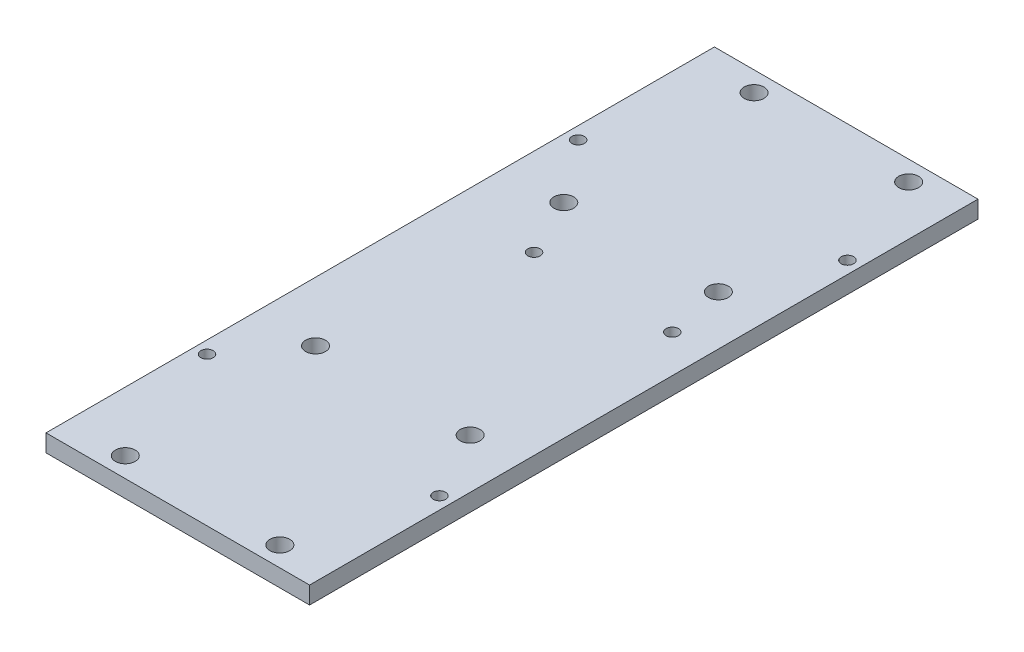
ISO-10303-21;
HEADER;
FILE_DESCRIPTION(('STEP AP214'),'2;1');
FILE_NAME('part.step','',(''),(''),'','','');
FILE_SCHEMA(('AUTOMOTIVE_DESIGN { 1 0 10303 214 1 1 1 1 }'));
ENDSEC;
DATA;
#1=APPLICATION_CONTEXT('core data for automotive mechanical design processes');
#2=APPLICATION_PROTOCOL_DEFINITION('international standard','automotive_design',2000,#1);
#3=PRODUCT_CONTEXT('',#1,'mechanical');
#4=PRODUCT('Part','Part','',(#3));
#5=PRODUCT_RELATED_PRODUCT_CATEGORY('part','',(#4));
#6=PRODUCT_DEFINITION_FORMATION('','',#4);
#7=PRODUCT_DEFINITION_CONTEXT('part definition',#1,'design');
#8=PRODUCT_DEFINITION('design','',#6,#7);
#9=PRODUCT_DEFINITION_SHAPE('','',#8);
#10=(LENGTH_UNIT() NAMED_UNIT(*) SI_UNIT(.MILLI.,.METRE.));
#11=(NAMED_UNIT(*) PLANE_ANGLE_UNIT() SI_UNIT($,.RADIAN.));
#12=(NAMED_UNIT(*) SI_UNIT($,.STERADIAN.) SOLID_ANGLE_UNIT());
#13=UNCERTAINTY_MEASURE_WITH_UNIT(LENGTH_MEASURE(1.E-05),#10,'distance_accuracy_value','');
#14=(GEOMETRIC_REPRESENTATION_CONTEXT(3) GLOBAL_UNCERTAINTY_ASSIGNED_CONTEXT((#13)) GLOBAL_UNIT_ASSIGNED_CONTEXT((#10,
#11,#12)) REPRESENTATION_CONTEXT('',''));
#15=CARTESIAN_POINT('',(0.,0.,0.));
#16=DIRECTION('',(0.,0.,1.));
#17=DIRECTION('',(1.,0.,0.));
#18=AXIS2_PLACEMENT_3D('',#15,#16,#17);
#19=CARTESIAN_POINT('',(0.,3.5,0.));
#20=DIRECTION('',(0.,1.,0.));
#21=DIRECTION('',(0.,0.,1.));
#22=AXIS2_PLACEMENT_3D('',#19,#20,#21);
#23=PLANE('',#22);
#24=CARTESIAN_POINT('',(-41.2,3.5,-92.5));
#25=DIRECTION('',(0.,1.,0.));
#26=DIRECTION('',(0.,0.,-1.));
#27=AXIS2_PLACEMENT_3D('',#24,#25,#26);
#28=CIRCLE('',#27,2.);
#29=CARTESIAN_POINT('',(-41.2,3.5,-94.5));
#30=VERTEX_POINT('',#29);
#31=EDGE_CURVE('E192',#30,#30,#28,.T.);
#32=ORIENTED_EDGE('',*,*,#31,.F.);
#33=EDGE_LOOP('',(#32));
#34=FACE_BOUND('',#33,.T.);
#35=CARTESIAN_POINT('',(-10.,3.5,-92.5));
#36=DIRECTION('',(0.,1.,0.));
#37=DIRECTION('',(0.,0.,-1.));
#38=AXIS2_PLACEMENT_3D('',#35,#36,#37);
#39=CIRCLE('',#38,2.);
#40=CARTESIAN_POINT('',(-10.,3.5,-94.5));
#41=VERTEX_POINT('',#40);
#42=EDGE_CURVE('E186',#41,#41,#39,.T.);
#43=ORIENTED_EDGE('',*,*,#42,.F.);
#44=EDGE_LOOP('',(#43));
#45=FACE_BOUND('',#44,.T.);
#46=CARTESIAN_POINT('',(-10.,3.5,-130.9));
#47=DIRECTION('',(0.,1.,0.));
#48=DIRECTION('',(0.,0.,-1.));
#49=AXIS2_PLACEMENT_3D('',#46,#47,#48);
#50=CIRCLE('',#49,2.);
#51=CARTESIAN_POINT('',(-10.,3.5,-132.9));
#52=VERTEX_POINT('',#51);
#53=EDGE_CURVE('E180',#52,#52,#50,.T.);
#54=ORIENTED_EDGE('',*,*,#53,.F.);
#55=EDGE_LOOP('',(#54));
#56=FACE_BOUND('',#55,.T.);
#57=CARTESIAN_POINT('',(-41.2,3.5,-130.9));
#58=DIRECTION('',(0.,1.,0.));
#59=DIRECTION('',(0.,0.,-1.));
#60=AXIS2_PLACEMENT_3D('',#57,#58,#59);
#61=CIRCLE('',#60,2.00000000000001);
#62=CARTESIAN_POINT('',(-41.2,3.5,-132.9));
#63=VERTEX_POINT('',#62);
#64=EDGE_CURVE('E174',#63,#63,#61,.T.);
#65=ORIENTED_EDGE('',*,*,#64,.F.);
#66=EDGE_LOOP('',(#65));
#67=FACE_BOUND('',#66,.T.);
#68=CARTESIAN_POINT('',(-9.99999999999999,3.5,-42.4));
#69=DIRECTION('',(0.,1.,0.));
#70=DIRECTION('',(0.,0.,1.));
#71=AXIS2_PLACEMENT_3D('',#68,#69,#70);
#72=CIRCLE('',#71,2.);
#73=CARTESIAN_POINT('',(-9.99999999999999,3.5,-40.4));
#74=VERTEX_POINT('',#73);
#75=EDGE_CURVE('E168',#74,#74,#72,.T.);
#76=ORIENTED_EDGE('',*,*,#75,.F.);
#77=EDGE_LOOP('',(#76));
#78=FACE_BOUND('',#77,.T.);
#79=CARTESIAN_POINT('',(-41.2,3.5,-42.4));
#80=DIRECTION('',(0.,1.,0.));
#81=DIRECTION('',(0.,0.,1.));
#82=AXIS2_PLACEMENT_3D('',#79,#80,#81);
#83=CIRCLE('',#82,2.);
#84=CARTESIAN_POINT('',(-41.2,3.5,-40.4));
#85=VERTEX_POINT('',#84);
#86=EDGE_CURVE('E162',#85,#85,#83,.T.);
#87=ORIENTED_EDGE('',*,*,#86,.F.);
#88=EDGE_LOOP('',(#87));
#89=FACE_BOUND('',#88,.T.);
#90=CARTESIAN_POINT('',(-9.99999999999999,3.5,-4.));
#91=DIRECTION('',(0.,1.,0.));
#92=DIRECTION('',(0.,0.,1.));
#93=AXIS2_PLACEMENT_3D('',#90,#91,#92);
#94=CIRCLE('',#93,2.);
#95=CARTESIAN_POINT('',(-9.99999999999999,3.5,-2.));
#96=VERTEX_POINT('',#95);
#97=EDGE_CURVE('E156',#96,#96,#94,.T.);
#98=ORIENTED_EDGE('',*,*,#97,.F.);
#99=EDGE_LOOP('',(#98));
#100=FACE_BOUND('',#99,.T.);
#101=CARTESIAN_POINT('',(-41.2,3.5,-4.));
#102=DIRECTION('',(0.,1.,0.));
#103=DIRECTION('',(0.,0.,1.));
#104=AXIS2_PLACEMENT_3D('',#101,#102,#103);
#105=CIRCLE('',#104,2.);
#106=CARTESIAN_POINT('',(-41.2,3.5,-2.));
#107=VERTEX_POINT('',#106);
#108=EDGE_CURVE('E150',#107,#107,#105,.T.);
#109=ORIENTED_EDGE('',*,*,#108,.F.);
#110=EDGE_LOOP('',(#109));
#111=FACE_BOUND('',#110,.T.);
#112=CARTESIAN_POINT('',(-50.7,3.5,-30.));
#113=DIRECTION('',(0.,1.,0.));
#114=DIRECTION('',(0.,0.,1.));
#115=AXIS2_PLACEMENT_3D('',#112,#113,#114);
#116=CIRCLE('',#115,1.25);
#117=CARTESIAN_POINT('',(-50.7,3.5,-28.75));
#118=VERTEX_POINT('',#117);
#119=EDGE_CURVE('E135',#118,#118,#116,.T.);
#120=ORIENTED_EDGE('',*,*,#119,.F.);
#121=EDGE_LOOP('',(#120));
#122=FACE_BOUND('',#121,.T.);
#123=CARTESIAN_POINT('',(-35.5,3.5,-80.8));
#124=DIRECTION('',(0.,1.,0.));
#125=DIRECTION('',(0.,0.,1.));
#126=AXIS2_PLACEMENT_3D('',#123,#124,#125);
#127=CIRCLE('',#126,1.25);
#128=CARTESIAN_POINT('',(-35.5,3.5,-79.55));
#129=VERTEX_POINT('',#128);
#130=EDGE_CURVE('E123',#129,#129,#127,.T.);
#131=ORIENTED_EDGE('',*,*,#130,.F.);
#132=EDGE_LOOP('',(#131));
#133=FACE_BOUND('',#132,.T.);
#134=CARTESIAN_POINT('',(-50.7,3.5,-104.9));
#135=DIRECTION('',(0.,1.,0.));
#136=DIRECTION('',(0.,0.,1.));
#137=AXIS2_PLACEMENT_3D('',#134,#135,#136);
#138=CIRCLE('',#137,1.25);
#139=CARTESIAN_POINT('',(-50.7,3.5,-103.65));
#140=VERTEX_POINT('',#139);
#141=EDGE_CURVE('E102',#140,#140,#138,.T.);
#142=ORIENTED_EDGE('',*,*,#141,.F.);
#143=EDGE_LOOP('',(#142));
#144=FACE_BOUND('',#143,.T.);
#145=DIRECTION('',(0.,0.,1.));
#146=VECTOR('',#145,1.);
#147=CARTESIAN_POINT('',(-53.2,3.5,-134.9));
#148=LINE('',#147,#146);
#149=CARTESIAN_POINT('',(-53.2,3.5,-134.9));
#150=VERTEX_POINT('',#149);
#151=CARTESIAN_POINT('',(-53.2,3.5,0.));
#152=VERTEX_POINT('',#151);
#153=EDGE_CURVE('E87',#150,#152,#148,.T.);
#154=ORIENTED_EDGE('',*,*,#153,.T.);
#155=DIRECTION('',(1.,0.,0.));
#156=VECTOR('',#155,1.);
#157=CARTESIAN_POINT('',(-53.2,3.5,0.));
#158=LINE('',#157,#156);
#159=CARTESIAN_POINT('',(0.,3.5,0.));
#160=VERTEX_POINT('',#159);
#161=EDGE_CURVE('E82',#152,#160,#158,.T.);
#162=ORIENTED_EDGE('',*,*,#161,.T.);
#163=DIRECTION('',(0.,0.,-1.));
#164=VECTOR('',#163,1.);
#165=CARTESIAN_POINT('',(0.,3.5,-134.9));
#166=LINE('',#165,#164);
#167=CARTESIAN_POINT('',(0.,3.5,-134.9));
#168=VERTEX_POINT('',#167);
#169=EDGE_CURVE('E85',#160,#168,#166,.T.);
#170=ORIENTED_EDGE('',*,*,#169,.T.);
#171=DIRECTION('',(-1.,0.,0.));
#172=VECTOR('',#171,1.);
#173=CARTESIAN_POINT('',(-53.2,3.5,-134.9));
#174=LINE('',#173,#172);
#175=EDGE_CURVE('E52',#168,#150,#174,.T.);
#176=ORIENTED_EDGE('',*,*,#175,.T.);
#177=EDGE_LOOP('',(#154,#162,#170,#176));
#178=FACE_BOUND('',#177,.T.);
#179=CARTESIAN_POINT('',(-2.5,3.5,-111.05));
#180=DIRECTION('',(0.,1.,0.));
#181=DIRECTION('',(0.,0.,1.));
#182=AXIS2_PLACEMENT_3D('',#179,#180,#181);
#183=CIRCLE('',#182,1.25);
#184=CARTESIAN_POINT('',(-2.5,3.5,-109.8));
#185=VERTEX_POINT('',#184);
#186=EDGE_CURVE('E117',#185,#185,#183,.T.);
#187=ORIENTED_EDGE('',*,*,#186,.F.);
#188=EDGE_LOOP('',(#187));
#189=FACE_BOUND('',#188,.T.);
#190=CARTESIAN_POINT('',(-7.60000000000001,3.5,-80.8));
#191=DIRECTION('',(0.,1.,0.));
#192=DIRECTION('',(0.,0.,1.));
#193=AXIS2_PLACEMENT_3D('',#190,#191,#192);
#194=CIRCLE('',#193,1.25);
#195=CARTESIAN_POINT('',(-7.60000000000001,3.5,-79.55));
#196=VERTEX_POINT('',#195);
#197=EDGE_CURVE('E129',#196,#196,#194,.T.);
#198=ORIENTED_EDGE('',*,*,#197,.F.);
#199=EDGE_LOOP('',(#198));
#200=FACE_BOUND('',#199,.T.);
#201=CARTESIAN_POINT('',(-2.49999999999999,3.5,-28.7));
#202=DIRECTION('',(0.,1.,0.));
#203=DIRECTION('',(0.,0.,1.));
#204=AXIS2_PLACEMENT_3D('',#201,#202,#203);
#205=CIRCLE('',#204,1.25);
#206=CARTESIAN_POINT('',(-2.49999999999999,3.5,-27.45));
#207=VERTEX_POINT('',#206);
#208=EDGE_CURVE('E141',#207,#207,#205,.T.);
#209=ORIENTED_EDGE('',*,*,#208,.F.);
#210=EDGE_LOOP('',(#209));
#211=FACE_BOUND('',#210,.T.);
#212=ADVANCED_FACE('F35',(#34,#45,#56,#67,#78,#89,#100,#111,#122,#133,#144,#178,#189,#200,#211),
#23,.T.);
#213=CARTESIAN_POINT('',(0.,0.,0.));
#214=DIRECTION('',(0.,1.,0.));
#215=DIRECTION('',(0.,0.,1.));
#216=AXIS2_PLACEMENT_3D('',#213,#214,#215);
#217=PLANE('',#216);
#218=CARTESIAN_POINT('',(-41.2,0.,-92.5));
#219=DIRECTION('',(0.,1.,0.));
#220=DIRECTION('',(0.,0.,-1.));
#221=AXIS2_PLACEMENT_3D('',#218,#219,#220);
#222=CIRCLE('',#221,2.);
#223=CARTESIAN_POINT('',(-41.2,0.,-94.5));
#224=VERTEX_POINT('',#223);
#225=EDGE_CURVE('E189',#224,#224,#222,.T.);
#226=ORIENTED_EDGE('',*,*,#225,.T.);
#227=EDGE_LOOP('',(#226));
#228=FACE_BOUND('',#227,.T.);
#229=CARTESIAN_POINT('',(-10.,0.,-92.5));
#230=DIRECTION('',(0.,1.,0.));
#231=DIRECTION('',(0.,0.,-1.));
#232=AXIS2_PLACEMENT_3D('',#229,#230,#231);
#233=CIRCLE('',#232,2.);
#234=CARTESIAN_POINT('',(-10.,0.,-94.5));
#235=VERTEX_POINT('',#234);
#236=EDGE_CURVE('E183',#235,#235,#233,.T.);
#237=ORIENTED_EDGE('',*,*,#236,.T.);
#238=EDGE_LOOP('',(#237));
#239=FACE_BOUND('',#238,.T.);
#240=CARTESIAN_POINT('',(-10.,0.,-130.9));
#241=DIRECTION('',(0.,1.,0.));
#242=DIRECTION('',(0.,0.,-1.));
#243=AXIS2_PLACEMENT_3D('',#240,#241,#242);
#244=CIRCLE('',#243,2.);
#245=CARTESIAN_POINT('',(-10.,0.,-132.9));
#246=VERTEX_POINT('',#245);
#247=EDGE_CURVE('E177',#246,#246,#244,.T.);
#248=ORIENTED_EDGE('',*,*,#247,.T.);
#249=EDGE_LOOP('',(#248));
#250=FACE_BOUND('',#249,.T.);
#251=CARTESIAN_POINT('',(-41.2,0.,-130.9));
#252=DIRECTION('',(0.,1.,0.));
#253=DIRECTION('',(0.,0.,-1.));
#254=AXIS2_PLACEMENT_3D('',#251,#252,#253);
#255=CIRCLE('',#254,2.00000000000001);
#256=CARTESIAN_POINT('',(-41.2,0.,-132.9));
#257=VERTEX_POINT('',#256);
#258=EDGE_CURVE('E171',#257,#257,#255,.T.);
#259=ORIENTED_EDGE('',*,*,#258,.T.);
#260=EDGE_LOOP('',(#259));
#261=FACE_BOUND('',#260,.T.);
#262=CARTESIAN_POINT('',(-9.99999999999999,0.,-42.4));
#263=DIRECTION('',(0.,1.,0.));
#264=DIRECTION('',(0.,0.,1.));
#265=AXIS2_PLACEMENT_3D('',#262,#263,#264);
#266=CIRCLE('',#265,2.);
#267=CARTESIAN_POINT('',(-9.99999999999999,0.,-40.4));
#268=VERTEX_POINT('',#267);
#269=EDGE_CURVE('E165',#268,#268,#266,.T.);
#270=ORIENTED_EDGE('',*,*,#269,.T.);
#271=EDGE_LOOP('',(#270));
#272=FACE_BOUND('',#271,.T.);
#273=CARTESIAN_POINT('',(-41.2,0.,-42.4));
#274=DIRECTION('',(0.,1.,0.));
#275=DIRECTION('',(0.,0.,1.));
#276=AXIS2_PLACEMENT_3D('',#273,#274,#275);
#277=CIRCLE('',#276,2.);
#278=CARTESIAN_POINT('',(-41.2,0.,-40.4));
#279=VERTEX_POINT('',#278);
#280=EDGE_CURVE('E159',#279,#279,#277,.T.);
#281=ORIENTED_EDGE('',*,*,#280,.T.);
#282=EDGE_LOOP('',(#281));
#283=FACE_BOUND('',#282,.T.);
#284=CARTESIAN_POINT('',(-9.99999999999999,0.,-4.));
#285=DIRECTION('',(0.,1.,0.));
#286=DIRECTION('',(0.,0.,1.));
#287=AXIS2_PLACEMENT_3D('',#284,#285,#286);
#288=CIRCLE('',#287,2.);
#289=CARTESIAN_POINT('',(-9.99999999999999,0.,-2.));
#290=VERTEX_POINT('',#289);
#291=EDGE_CURVE('E153',#290,#290,#288,.T.);
#292=ORIENTED_EDGE('',*,*,#291,.T.);
#293=EDGE_LOOP('',(#292));
#294=FACE_BOUND('',#293,.T.);
#295=CARTESIAN_POINT('',(-41.2,0.,-4.));
#296=DIRECTION('',(0.,1.,0.));
#297=DIRECTION('',(0.,0.,1.));
#298=AXIS2_PLACEMENT_3D('',#295,#296,#297);
#299=CIRCLE('',#298,2.);
#300=CARTESIAN_POINT('',(-41.2,0.,-2.));
#301=VERTEX_POINT('',#300);
#302=EDGE_CURVE('E147',#301,#301,#299,.T.);
#303=ORIENTED_EDGE('',*,*,#302,.T.);
#304=EDGE_LOOP('',(#303));
#305=FACE_BOUND('',#304,.T.);
#306=CARTESIAN_POINT('',(-50.7,0.,-30.));
#307=DIRECTION('',(0.,1.,0.));
#308=DIRECTION('',(0.,0.,1.));
#309=AXIS2_PLACEMENT_3D('',#306,#307,#308);
#310=CIRCLE('',#309,1.25);
#311=CARTESIAN_POINT('',(-50.7,0.,-28.75));
#312=VERTEX_POINT('',#311);
#313=EDGE_CURVE('E138',#312,#312,#310,.T.);
#314=ORIENTED_EDGE('',*,*,#313,.T.);
#315=EDGE_LOOP('',(#314));
#316=FACE_BOUND('',#315,.T.);
#317=CARTESIAN_POINT('',(-35.5,0.,-80.8));
#318=DIRECTION('',(0.,1.,0.));
#319=DIRECTION('',(0.,0.,1.));
#320=AXIS2_PLACEMENT_3D('',#317,#318,#319);
#321=CIRCLE('',#320,1.25);
#322=CARTESIAN_POINT('',(-35.5,0.,-79.55));
#323=VERTEX_POINT('',#322);
#324=EDGE_CURVE('E126',#323,#323,#321,.T.);
#325=ORIENTED_EDGE('',*,*,#324,.T.);
#326=EDGE_LOOP('',(#325));
#327=FACE_BOUND('',#326,.T.);
#328=CARTESIAN_POINT('',(-50.7,0.,-104.9));
#329=DIRECTION('',(0.,1.,0.));
#330=DIRECTION('',(0.,0.,1.));
#331=AXIS2_PLACEMENT_3D('',#328,#329,#330);
#332=CIRCLE('',#331,1.25);
#333=CARTESIAN_POINT('',(-50.7,0.,-103.65));
#334=VERTEX_POINT('',#333);
#335=EDGE_CURVE('E114',#334,#334,#332,.T.);
#336=ORIENTED_EDGE('',*,*,#335,.T.);
#337=EDGE_LOOP('',(#336));
#338=FACE_BOUND('',#337,.T.);
#339=DIRECTION('',(0.,0.,1.));
#340=VECTOR('',#339,1.);
#341=CARTESIAN_POINT('',(-53.2,0.,-134.9));
#342=LINE('',#341,#340);
#343=CARTESIAN_POINT('',(-53.2,0.,-134.9));
#344=VERTEX_POINT('',#343);
#345=CARTESIAN_POINT('',(-53.2,0.,0.));
#346=VERTEX_POINT('',#345);
#347=EDGE_CURVE('E99',#344,#346,#342,.T.);
#348=ORIENTED_EDGE('',*,*,#347,.F.);
#349=DIRECTION('',(-1.,0.,0.));
#350=VECTOR('',#349,1.);
#351=CARTESIAN_POINT('',(-53.2,0.,-134.9));
#352=LINE('',#351,#350);
#353=CARTESIAN_POINT('',(0.,0.,-134.9));
#354=VERTEX_POINT('',#353);
#355=EDGE_CURVE('E75',#354,#344,#352,.T.);
#356=ORIENTED_EDGE('',*,*,#355,.F.);
#357=DIRECTION('',(0.,0.,-1.));
#358=VECTOR('',#357,1.);
#359=CARTESIAN_POINT('',(0.,0.,-134.9));
#360=LINE('',#359,#358);
#361=CARTESIAN_POINT('',(0.,0.,0.));
#362=VERTEX_POINT('',#361);
#363=EDGE_CURVE('E69',#362,#354,#360,.T.);
#364=ORIENTED_EDGE('',*,*,#363,.F.);
#365=DIRECTION('',(1.,0.,0.));
#366=VECTOR('',#365,1.);
#367=CARTESIAN_POINT('',(-53.2,0.,0.));
#368=LINE('',#367,#366);
#369=EDGE_CURVE('E91',#346,#362,#368,.T.);
#370=ORIENTED_EDGE('',*,*,#369,.F.);
#371=EDGE_LOOP('',(#348,#356,#364,#370));
#372=FACE_BOUND('',#371,.T.);
#373=CARTESIAN_POINT('',(-2.5,0.,-111.05));
#374=DIRECTION('',(0.,1.,0.));
#375=DIRECTION('',(0.,0.,1.));
#376=AXIS2_PLACEMENT_3D('',#373,#374,#375);
#377=CIRCLE('',#376,1.25);
#378=CARTESIAN_POINT('',(-2.5,0.,-109.8));
#379=VERTEX_POINT('',#378);
#380=EDGE_CURVE('E120',#379,#379,#377,.T.);
#381=ORIENTED_EDGE('',*,*,#380,.T.);
#382=EDGE_LOOP('',(#381));
#383=FACE_BOUND('',#382,.T.);
#384=CARTESIAN_POINT('',(-7.60000000000001,0.,-80.8));
#385=DIRECTION('',(0.,1.,0.));
#386=DIRECTION('',(0.,0.,1.));
#387=AXIS2_PLACEMENT_3D('',#384,#385,#386);
#388=CIRCLE('',#387,1.25);
#389=CARTESIAN_POINT('',(-7.60000000000001,0.,-79.55));
#390=VERTEX_POINT('',#389);
#391=EDGE_CURVE('E132',#390,#390,#388,.T.);
#392=ORIENTED_EDGE('',*,*,#391,.T.);
#393=EDGE_LOOP('',(#392));
#394=FACE_BOUND('',#393,.T.);
#395=CARTESIAN_POINT('',(-2.49999999999999,0.,-28.7));
#396=DIRECTION('',(0.,1.,0.));
#397=DIRECTION('',(0.,0.,1.));
#398=AXIS2_PLACEMENT_3D('',#395,#396,#397);
#399=CIRCLE('',#398,1.25);
#400=CARTESIAN_POINT('',(-2.49999999999999,0.,-27.45));
#401=VERTEX_POINT('',#400);
#402=EDGE_CURVE('E144',#401,#401,#399,.T.);
#403=ORIENTED_EDGE('',*,*,#402,.T.);
#404=EDGE_LOOP('',(#403));
#405=FACE_BOUND('',#404,.T.);
#406=ADVANCED_FACE('F110',(#228,#239,#250,#261,#272,#283,#294,#305,#316,#327,#338,#372,#383,
#394,#405),#217,.F.);
#407=CARTESIAN_POINT('',(-53.2,3.5,-134.9));
#408=DIRECTION('',(1.,0.,0.));
#409=DIRECTION('',(0.,0.,-1.));
#410=AXIS2_PLACEMENT_3D('',#407,#408,#409);
#411=PLANE('',#410);
#412=ORIENTED_EDGE('',*,*,#347,.T.);
#413=DIRECTION('',(0.,-1.,0.));
#414=VECTOR('',#413,1.);
#415=CARTESIAN_POINT('',(-53.2,3.5,0.));
#416=LINE('',#415,#414);
#417=EDGE_CURVE('E11',#152,#346,#416,.T.);
#418=ORIENTED_EDGE('',*,*,#417,.F.);
#419=ORIENTED_EDGE('',*,*,#153,.F.);
#420=DIRECTION('',(0.,-1.,0.));
#421=VECTOR('',#420,1.);
#422=CARTESIAN_POINT('',(-53.2,3.5,-134.9));
#423=LINE('',#422,#421);
#424=EDGE_CURVE('E95',#150,#344,#423,.T.);
#425=ORIENTED_EDGE('',*,*,#424,.T.);
#426=EDGE_LOOP('',(#412,#418,#419,#425));
#427=FACE_BOUND('',#426,.T.);
#428=ADVANCED_FACE('F37',(#427),#411,.F.);
#429=CARTESIAN_POINT('',(-53.2,3.5,0.));
#430=DIRECTION('',(0.,0.,-1.));
#431=DIRECTION('',(-1.,0.,0.));
#432=AXIS2_PLACEMENT_3D('',#429,#430,#431);
#433=PLANE('',#432);
#434=ORIENTED_EDGE('',*,*,#369,.T.);
#435=DIRECTION('',(0.,-1.,0.));
#436=VECTOR('',#435,1.);
#437=CARTESIAN_POINT('',(0.,3.5,0.));
#438=LINE('',#437,#436);
#439=EDGE_CURVE('E44',#160,#362,#438,.T.);
#440=ORIENTED_EDGE('',*,*,#439,.F.);
#441=ORIENTED_EDGE('',*,*,#161,.F.);
#442=ORIENTED_EDGE('',*,*,#417,.T.);
#443=EDGE_LOOP('',(#434,#440,#441,#442));
#444=FACE_BOUND('',#443,.T.);
#445=ADVANCED_FACE('F90',(#444),#433,.F.);
#446=CARTESIAN_POINT('',(0.,3.5,-134.9));
#447=DIRECTION('',(-1.,0.,0.));
#448=DIRECTION('',(0.,0.,1.));
#449=AXIS2_PLACEMENT_3D('',#446,#447,#448);
#450=PLANE('',#449);
#451=ORIENTED_EDGE('',*,*,#363,.T.);
#452=DIRECTION('',(0.,-1.,0.));
#453=VECTOR('',#452,1.);
#454=CARTESIAN_POINT('',(0.,3.5,-134.9));
#455=LINE('',#454,#453);
#456=EDGE_CURVE('E92',#168,#354,#455,.T.);
#457=ORIENTED_EDGE('',*,*,#456,.F.);
#458=ORIENTED_EDGE('',*,*,#169,.F.);
#459=ORIENTED_EDGE('',*,*,#439,.T.);
#460=EDGE_LOOP('',(#451,#457,#458,#459));
#461=FACE_BOUND('',#460,.T.);
#462=ADVANCED_FACE('F93',(#461),#450,.F.);
#463=CARTESIAN_POINT('',(-53.2,3.5,-134.9));
#464=DIRECTION('',(0.,0.,1.));
#465=DIRECTION('',(1.,0.,0.));
#466=AXIS2_PLACEMENT_3D('',#463,#464,#465);
#467=PLANE('',#466);
#468=ORIENTED_EDGE('',*,*,#355,.T.);
#469=ORIENTED_EDGE('',*,*,#424,.F.);
#470=ORIENTED_EDGE('',*,*,#175,.F.);
#471=ORIENTED_EDGE('',*,*,#456,.T.);
#472=EDGE_LOOP('',(#468,#469,#470,#471));
#473=FACE_BOUND('',#472,.T.);
#474=ADVANCED_FACE('F107',(#473),#467,.F.);
#475=CARTESIAN_POINT('',(-50.7,3.5,-104.9));
#476=DIRECTION('',(0.,-1.,0.));
#477=DIRECTION('',(0.,0.,-1.));
#478=AXIS2_PLACEMENT_3D('',#475,#476,#477);
#479=CYLINDRICAL_SURFACE('',#478,1.25);
#480=ORIENTED_EDGE('',*,*,#141,.T.);
#481=EDGE_LOOP('',(#480));
#482=FACE_BOUND('',#481,.T.);
#483=ORIENTED_EDGE('',*,*,#335,.F.);
#484=EDGE_LOOP('',(#483));
#485=FACE_BOUND('',#484,.T.);
#486=ADVANCED_FACE('F230',(#482,#485),#479,.F.);
#487=CARTESIAN_POINT('',(-2.5,3.5,-111.05));
#488=DIRECTION('',(0.,-1.,0.));
#489=DIRECTION('',(0.,0.,-1.));
#490=AXIS2_PLACEMENT_3D('',#487,#488,#489);
#491=CYLINDRICAL_SURFACE('',#490,1.25);
#492=ORIENTED_EDGE('',*,*,#186,.T.);
#493=EDGE_LOOP('',(#492));
#494=FACE_BOUND('',#493,.T.);
#495=ORIENTED_EDGE('',*,*,#380,.F.);
#496=EDGE_LOOP('',(#495));
#497=FACE_BOUND('',#496,.T.);
#498=ADVANCED_FACE('F233',(#494,#497),#491,.F.);
#499=CARTESIAN_POINT('',(-35.5,3.5,-80.8));
#500=DIRECTION('',(0.,-1.,0.));
#501=DIRECTION('',(0.,0.,-1.));
#502=AXIS2_PLACEMENT_3D('',#499,#500,#501);
#503=CYLINDRICAL_SURFACE('',#502,1.25);
#504=ORIENTED_EDGE('',*,*,#130,.T.);
#505=EDGE_LOOP('',(#504));
#506=FACE_BOUND('',#505,.T.);
#507=ORIENTED_EDGE('',*,*,#324,.F.);
#508=EDGE_LOOP('',(#507));
#509=FACE_BOUND('',#508,.T.);
#510=ADVANCED_FACE('F269',(#506,#509),#503,.F.);
#511=CARTESIAN_POINT('',(-7.60000000000001,3.5,-80.8));
#512=DIRECTION('',(0.,-1.,0.));
#513=DIRECTION('',(0.,0.,-1.));
#514=AXIS2_PLACEMENT_3D('',#511,#512,#513);
#515=CYLINDRICAL_SURFACE('',#514,1.25);
#516=ORIENTED_EDGE('',*,*,#197,.T.);
#517=EDGE_LOOP('',(#516));
#518=FACE_BOUND('',#517,.T.);
#519=ORIENTED_EDGE('',*,*,#391,.F.);
#520=EDGE_LOOP('',(#519));
#521=FACE_BOUND('',#520,.T.);
#522=ADVANCED_FACE('F277',(#518,#521),#515,.F.);
#523=CARTESIAN_POINT('',(-50.7,3.5,-30.));
#524=DIRECTION('',(0.,-1.,0.));
#525=DIRECTION('',(0.,0.,-1.));
#526=AXIS2_PLACEMENT_3D('',#523,#524,#525);
#527=CYLINDRICAL_SURFACE('',#526,1.25);
#528=ORIENTED_EDGE('',*,*,#119,.T.);
#529=EDGE_LOOP('',(#528));
#530=FACE_BOUND('',#529,.T.);
#531=ORIENTED_EDGE('',*,*,#313,.F.);
#532=EDGE_LOOP('',(#531));
#533=FACE_BOUND('',#532,.T.);
#534=ADVANCED_FACE('F285',(#530,#533),#527,.F.);
#535=CARTESIAN_POINT('',(-2.49999999999999,3.5,-28.7));
#536=DIRECTION('',(0.,-1.,0.));
#537=DIRECTION('',(0.,0.,-1.));
#538=AXIS2_PLACEMENT_3D('',#535,#536,#537);
#539=CYLINDRICAL_SURFACE('',#538,1.25);
#540=ORIENTED_EDGE('',*,*,#208,.T.);
#541=EDGE_LOOP('',(#540));
#542=FACE_BOUND('',#541,.T.);
#543=ORIENTED_EDGE('',*,*,#402,.F.);
#544=EDGE_LOOP('',(#543));
#545=FACE_BOUND('',#544,.T.);
#546=ADVANCED_FACE('F293',(#542,#545),#539,.F.);
#547=CARTESIAN_POINT('',(-41.2,0.,-4.));
#548=DIRECTION('',(0.,1.,0.));
#549=DIRECTION('',(0.,0.,1.));
#550=AXIS2_PLACEMENT_3D('',#547,#548,#549);
#551=CYLINDRICAL_SURFACE('',#550,2.);
#552=ORIENTED_EDGE('',*,*,#302,.F.);
#553=EDGE_LOOP('',(#552));
#554=FACE_BOUND('',#553,.T.);
#555=ORIENTED_EDGE('',*,*,#108,.T.);
#556=EDGE_LOOP('',(#555));
#557=FACE_BOUND('',#556,.T.);
#558=ADVANCED_FACE('F301',(#554,#557),#551,.F.);
#559=CARTESIAN_POINT('',(-9.99999999999999,0.,-4.));
#560=DIRECTION('',(0.,1.,0.));
#561=DIRECTION('',(0.,0.,1.));
#562=AXIS2_PLACEMENT_3D('',#559,#560,#561);
#563=CYLINDRICAL_SURFACE('',#562,2.);
#564=ORIENTED_EDGE('',*,*,#291,.F.);
#565=EDGE_LOOP('',(#564));
#566=FACE_BOUND('',#565,.T.);
#567=ORIENTED_EDGE('',*,*,#97,.T.);
#568=EDGE_LOOP('',(#567));
#569=FACE_BOUND('',#568,.T.);
#570=ADVANCED_FACE('F310',(#566,#569),#563,.F.);
#571=CARTESIAN_POINT('',(-41.2,0.,-42.4));
#572=DIRECTION('',(0.,1.,0.));
#573=DIRECTION('',(0.,0.,1.));
#574=AXIS2_PLACEMENT_3D('',#571,#572,#573);
#575=CYLINDRICAL_SURFACE('',#574,2.);
#576=ORIENTED_EDGE('',*,*,#280,.F.);
#577=EDGE_LOOP('',(#576));
#578=FACE_BOUND('',#577,.T.);
#579=ORIENTED_EDGE('',*,*,#86,.T.);
#580=EDGE_LOOP('',(#579));
#581=FACE_BOUND('',#580,.T.);
#582=ADVANCED_FACE('F318',(#578,#581),#575,.F.);
#583=CARTESIAN_POINT('',(-9.99999999999999,0.,-42.4));
#584=DIRECTION('',(0.,1.,0.));
#585=DIRECTION('',(0.,0.,1.));
#586=AXIS2_PLACEMENT_3D('',#583,#584,#585);
#587=CYLINDRICAL_SURFACE('',#586,2.);
#588=ORIENTED_EDGE('',*,*,#269,.F.);
#589=EDGE_LOOP('',(#588));
#590=FACE_BOUND('',#589,.T.);
#591=ORIENTED_EDGE('',*,*,#75,.T.);
#592=EDGE_LOOP('',(#591));
#593=FACE_BOUND('',#592,.T.);
#594=ADVANCED_FACE('F326',(#590,#593),#587,.F.);
#595=CARTESIAN_POINT('',(-41.2,0.,-130.9));
#596=DIRECTION('',(0.,1.,0.));
#597=DIRECTION('',(0.,0.,1.));
#598=AXIS2_PLACEMENT_3D('',#595,#596,#597);
#599=CYLINDRICAL_SURFACE('',#598,2.00000000000001);
#600=ORIENTED_EDGE('',*,*,#258,.F.);
#601=EDGE_LOOP('',(#600));
#602=FACE_BOUND('',#601,.T.);
#603=ORIENTED_EDGE('',*,*,#64,.T.);
#604=EDGE_LOOP('',(#603));
#605=FACE_BOUND('',#604,.T.);
#606=ADVANCED_FACE('F334',(#602,#605),#599,.F.);
#607=CARTESIAN_POINT('',(-10.,0.,-130.9));
#608=DIRECTION('',(0.,1.,0.));
#609=DIRECTION('',(0.,0.,1.));
#610=AXIS2_PLACEMENT_3D('',#607,#608,#609);
#611=CYLINDRICAL_SURFACE('',#610,2.);
#612=ORIENTED_EDGE('',*,*,#247,.F.);
#613=EDGE_LOOP('',(#612));
#614=FACE_BOUND('',#613,.T.);
#615=ORIENTED_EDGE('',*,*,#53,.T.);
#616=EDGE_LOOP('',(#615));
#617=FACE_BOUND('',#616,.T.);
#618=ADVANCED_FACE('F342',(#614,#617),#611,.F.);
#619=CARTESIAN_POINT('',(-10.,0.,-92.5));
#620=DIRECTION('',(0.,1.,0.));
#621=DIRECTION('',(0.,0.,1.));
#622=AXIS2_PLACEMENT_3D('',#619,#620,#621);
#623=CYLINDRICAL_SURFACE('',#622,2.);
#624=ORIENTED_EDGE('',*,*,#236,.F.);
#625=EDGE_LOOP('',(#624));
#626=FACE_BOUND('',#625,.T.);
#627=ORIENTED_EDGE('',*,*,#42,.T.);
#628=EDGE_LOOP('',(#627));
#629=FACE_BOUND('',#628,.T.);
#630=ADVANCED_FACE('F203',(#626,#629),#623,.F.);
#631=CARTESIAN_POINT('',(-41.2,0.,-92.5));
#632=DIRECTION('',(0.,1.,0.));
#633=DIRECTION('',(0.,0.,1.));
#634=AXIS2_PLACEMENT_3D('',#631,#632,#633);
#635=CYLINDRICAL_SURFACE('',#634,2.);
#636=ORIENTED_EDGE('',*,*,#225,.F.);
#637=EDGE_LOOP('',(#636));
#638=FACE_BOUND('',#637,.T.);
#639=ORIENTED_EDGE('',*,*,#31,.T.);
#640=EDGE_LOOP('',(#639));
#641=FACE_BOUND('',#640,.T.);
#642=ADVANCED_FACE('F200',(#638,#641),#635,.F.);
#643=CLOSED_SHELL('',(#212,#406,#428,#445,#462,#474,#486,#498,#510,#522,#534,#546,#558,#570,
#582,#594,#606,#618,#630,#642));
#644=MANIFOLD_SOLID_BREP('B2',#643);
#645=ADVANCED_BREP_SHAPE_REPRESENTATION('',(#18,#644),#14);
#646=SHAPE_DEFINITION_REPRESENTATION(#9,#645);
ENDSEC;
END-ISO-10303-21;
